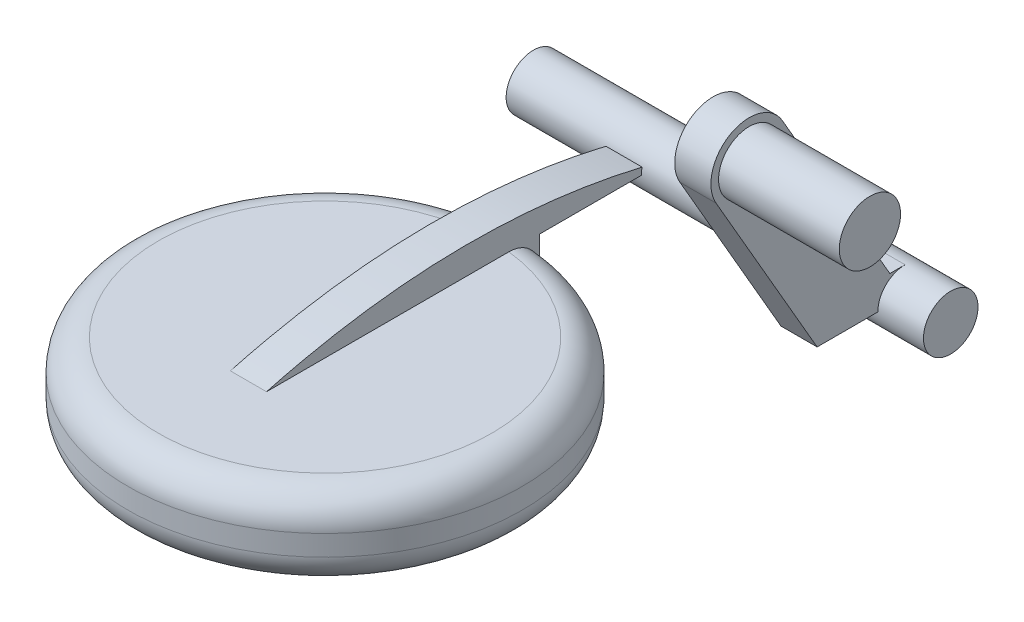
ISO-10303-21;
HEADER;
FILE_DESCRIPTION(('STEP AP214'),'2;1');
FILE_NAME('part.step','',(''),(''),'','','');
FILE_SCHEMA(('AUTOMOTIVE_DESIGN { 1 0 10303 214 1 1 1 1 }'));
ENDSEC;
DATA;
#1=APPLICATION_CONTEXT('core data for automotive mechanical design processes');
#2=APPLICATION_PROTOCOL_DEFINITION('international standard','automotive_design',2000,#1);
#3=PRODUCT_CONTEXT('',#1,'mechanical');
#4=PRODUCT('Part','Part','',(#3));
#5=PRODUCT_RELATED_PRODUCT_CATEGORY('part','',(#4));
#6=PRODUCT_DEFINITION_FORMATION('','',#4);
#7=PRODUCT_DEFINITION_CONTEXT('part definition',#1,'design');
#8=PRODUCT_DEFINITION('design','',#6,#7);
#9=PRODUCT_DEFINITION_SHAPE('','',#8);
#10=(LENGTH_UNIT() NAMED_UNIT(*) SI_UNIT(.MILLI.,.METRE.));
#11=(NAMED_UNIT(*) PLANE_ANGLE_UNIT() SI_UNIT($,.RADIAN.));
#12=(NAMED_UNIT(*) SI_UNIT($,.STERADIAN.) SOLID_ANGLE_UNIT());
#13=UNCERTAINTY_MEASURE_WITH_UNIT(LENGTH_MEASURE(1.E-05),#10,'distance_accuracy_value','');
#14=(GEOMETRIC_REPRESENTATION_CONTEXT(3) GLOBAL_UNCERTAINTY_ASSIGNED_CONTEXT((#13)) GLOBAL_UNIT_ASSIGNED_CONTEXT((#10,
#11,#12)) REPRESENTATION_CONTEXT('',''));
#15=CARTESIAN_POINT('',(0.,0.,0.));
#16=DIRECTION('',(0.,0.,1.));
#17=DIRECTION('',(1.,0.,0.));
#18=AXIS2_PLACEMENT_3D('',#15,#16,#17);
#19=CARTESIAN_POINT('',(34.5948,0.,0.));
#20=DIRECTION('',(-1.,0.,0.));
#21=DIRECTION('',(0.,0.,1.));
#22=AXIS2_PLACEMENT_3D('',#19,#20,#21);
#23=CYLINDRICAL_SURFACE('',#22,2.2606);
#24=CARTESIAN_POINT('',(0.,0.,0.));
#25=DIRECTION('',(1.,0.,0.));
#26=DIRECTION('',(0.,0.,-1.));
#27=AXIS2_PLACEMENT_3D('',#24,#25,#26);
#28=CIRCLE('',#27,2.2606);
#29=CARTESIAN_POINT('',(0.,0.,-2.2606));
#30=VERTEX_POINT('',#29);
#31=EDGE_CURVE('E252',#30,#30,#28,.T.);
#32=ORIENTED_EDGE('',*,*,#31,.T.);
#33=EDGE_LOOP('',(#32));
#34=FACE_BOUND('',#33,.T.);
#35=CARTESIAN_POINT('',(34.5948,0.,0.));
#36=DIRECTION('',(1.,0.,0.));
#37=DIRECTION('',(0.,0.,-1.));
#38=AXIS2_PLACEMENT_3D('',#35,#36,#37);
#39=CIRCLE('',#38,2.2606);
#40=CARTESIAN_POINT('',(34.5948,0.,-2.2606));
#41=VERTEX_POINT('',#40);
#42=EDGE_CURVE('E253',#41,#41,#39,.T.);
#43=ORIENTED_EDGE('',*,*,#42,.F.);
#44=EDGE_LOOP('',(#43));
#45=FACE_BOUND('',#44,.T.);
#46=DIRECTION('',(-1.,0.,0.));
#47=VECTOR('',#46,1.);
#48=CARTESIAN_POINT('',(11.2014,0.56020200266015,2.19008814348089));
#49=LINE('',#48,#47);
#50=CARTESIAN_POINT('',(11.2014,0.56020200266015,2.19008814348089));
#51=VERTEX_POINT('',#50);
#52=CARTESIAN_POINT('',(8.2042,0.56020200266015,2.19008814348089));
#53=VERTEX_POINT('',#52);
#54=EDGE_CURVE('E266',#51,#53,#49,.T.);
#55=ORIENTED_EDGE('',*,*,#54,.F.);
#56=CARTESIAN_POINT('',(11.2014,0.,0.));
#57=DIRECTION('',(1.,0.,0.));
#58=DIRECTION('',(0.,0.,-1.));
#59=AXIS2_PLACEMENT_3D('',#56,#57,#58);
#60=CIRCLE('',#59,2.2606);
#61=CARTESIAN_POINT('',(11.2014,0.,2.2606));
#62=VERTEX_POINT('',#61);
#63=EDGE_CURVE('E269',#51,#62,#60,.T.);
#64=ORIENTED_EDGE('',*,*,#63,.T.);
#65=DIRECTION('',(-1.,0.,0.));
#66=VECTOR('',#65,1.);
#67=CARTESIAN_POINT('',(34.5948,0.,2.2606));
#68=LINE('',#67,#66);
#69=CARTESIAN_POINT('',(8.2042,0.,2.2606));
#70=VERTEX_POINT('',#69);
#71=EDGE_CURVE('E262',#70,#62,#68,.F.);
#72=ORIENTED_EDGE('',*,*,#71,.F.);
#73=CARTESIAN_POINT('',(8.2042,0.,0.));
#74=DIRECTION('',(1.,0.,0.));
#75=DIRECTION('',(0.,0.,-1.));
#76=AXIS2_PLACEMENT_3D('',#73,#74,#75);
#77=CIRCLE('',#76,2.2606);
#78=EDGE_CURVE('E233',#53,#70,#77,.T.);
#79=ORIENTED_EDGE('',*,*,#78,.F.);
#80=EDGE_LOOP('',(#55,#64,#72,#79));
#81=FACE_BOUND('',#80,.T.);
#82=CARTESIAN_POINT('',(30.8102,0.,0.));
#83=DIRECTION('',(-1.,0.,0.));
#84=DIRECTION('',(0.,0.,1.));
#85=AXIS2_PLACEMENT_3D('',#82,#83,#84);
#86=CIRCLE('',#85,2.2606);
#87=CARTESIAN_POINT('',(30.8102,0.,2.2606));
#88=VERTEX_POINT('',#87);
#89=CARTESIAN_POINT('',(30.8102,2.2606,0.));
#90=VERTEX_POINT('',#89);
#91=EDGE_CURVE('E48',#88,#90,#86,.T.);
#92=ORIENTED_EDGE('',*,*,#91,.F.);
#93=DIRECTION('',(-1.,0.,0.));
#94=VECTOR('',#93,1.);
#95=CARTESIAN_POINT('',(34.5948,0.,2.2606));
#96=LINE('',#95,#94);
#97=CARTESIAN_POINT('',(27.813,0.,2.2606));
#98=VERTEX_POINT('',#97);
#99=EDGE_CURVE('E138',#98,#88,#96,.F.);
#100=ORIENTED_EDGE('',*,*,#99,.F.);
#101=CARTESIAN_POINT('',(27.813,0.,0.));
#102=DIRECTION('',(-1.,0.,0.));
#103=DIRECTION('',(0.,0.,1.));
#104=AXIS2_PLACEMENT_3D('',#101,#102,#103);
#105=CIRCLE('',#104,2.2606);
#106=CARTESIAN_POINT('',(27.813,2.2606,0.));
#107=VERTEX_POINT('',#106);
#108=EDGE_CURVE('E148',#98,#107,#105,.T.);
#109=ORIENTED_EDGE('',*,*,#108,.T.);
#110=DIRECTION('',(-1.,0.,0.));
#111=VECTOR('',#110,1.);
#112=CARTESIAN_POINT('',(30.8102,2.2606,0.));
#113=LINE('',#112,#111);
#114=EDGE_CURVE('E55',#90,#107,#113,.T.);
#115=ORIENTED_EDGE('',*,*,#114,.F.);
#116=EDGE_LOOP('',(#92,#100,#109,#115));
#117=FACE_BOUND('',#116,.T.);
#118=ADVANCED_FACE('F39',(#34,#45,#81,#117),#23,.T.);
#119=CARTESIAN_POINT('',(34.5948,0.,0.));
#120=DIRECTION('',(1.,0.,0.));
#121=DIRECTION('',(0.,0.,-1.));
#122=AXIS2_PLACEMENT_3D('',#119,#120,#121);
#123=PLANE('',#122);
#124=ORIENTED_EDGE('',*,*,#42,.T.);
#125=EDGE_LOOP('',(#124));
#126=FACE_BOUND('',#125,.T.);
#127=ADVANCED_FACE('F182',(#126),#123,.T.);
#128=CARTESIAN_POINT('',(0.,0.,0.));
#129=DIRECTION('',(1.,0.,0.));
#130=DIRECTION('',(0.,0.,-1.));
#131=AXIS2_PLACEMENT_3D('',#128,#129,#130);
#132=PLANE('',#131);
#133=ORIENTED_EDGE('',*,*,#31,.F.);
#134=EDGE_LOOP('',(#133));
#135=FACE_BOUND('',#134,.T.);
#136=ADVANCED_FACE('F179',(#135),#132,.F.);
#137=CARTESIAN_POINT('',(11.2014,0.,0.));
#138=CARTESIAN_POINT('',(11.2014,4.52526673633943,16.5083535764566));
#139=CARTESIAN_POINT('',(11.2014,0.,33.3248));
#140=B_SPLINE_CURVE_WITH_KNOTS('',2,(#137,#138,#139),.UNSPECIFIED.,.F.,.F.,(3,3),(0.,1.),.UNSPECIFIED.);
#141=DIRECTION('',(-1.,0.,0.));
#142=VECTOR('',#141,1.);
#143=SURFACE_OF_LINEAR_EXTRUSION('',#140,#142);
#144=CARTESIAN_POINT('',(11.2014,0.,33.3248));
#145=VERTEX_POINT('',#144);
#146=EDGE_CURVE('E160',#51,#145,#140,.T.);
#147=ORIENTED_EDGE('',*,*,#146,.F.);
#148=ORIENTED_EDGE('',*,*,#54,.T.);
#149=CARTESIAN_POINT('',(8.2042,0.,0.));
#150=CARTESIAN_POINT('',(8.2042,4.52526673633943,16.5083535764566));
#151=CARTESIAN_POINT('',(8.2042,0.,33.3248));
#152=B_SPLINE_CURVE_WITH_KNOTS('',2,(#149,#150,#151),.UNSPECIFIED.,.F.,.F.,(3,3),(0.,1.),.UNSPECIFIED.);
#153=CARTESIAN_POINT('',(8.2042,0.,33.3248));
#154=VERTEX_POINT('',#153);
#155=EDGE_CURVE('E154',#53,#154,#152,.T.);
#156=ORIENTED_EDGE('',*,*,#155,.T.);
#157=DIRECTION('',(-1.,0.,0.));
#158=VECTOR('',#157,1.);
#159=CARTESIAN_POINT('',(11.2014,0.,33.3248));
#160=LINE('',#159,#158);
#161=EDGE_CURVE('E249',#145,#154,#160,.T.);
#162=ORIENTED_EDGE('',*,*,#161,.F.);
#163=EDGE_LOOP('',(#147,#148,#156,#162));
#164=FACE_BOUND('',#163,.T.);
#165=ADVANCED_FACE('F174',(#164),#143,.F.);
#166=CARTESIAN_POINT('',(11.2014,0.,0.));
#167=DIRECTION('',(0.,1.,0.));
#168=DIRECTION('',(0.,0.,1.));
#169=AXIS2_PLACEMENT_3D('',#166,#167,#168);
#170=PLANE('',#169);
#171=CARTESIAN_POINT('',(9.7028,0.,26.9748));
#172=DIRECTION('',(0.,-1.,0.));
#173=DIRECTION('',(0.,0.,-1.));
#174=AXIS2_PLACEMENT_3D('',#171,#172,#173);
#175=CIRCLE('',#174,16.3576);
#176=CARTESIAN_POINT('',(8.2042,0.,10.6859917010482));
#177=VERTEX_POINT('',#176);
#178=CARTESIAN_POINT('',(11.2014,0.,10.6859917010482));
#179=VERTEX_POINT('',#178);
#180=EDGE_CURVE('E150',#177,#179,#175,.T.);
#181=ORIENTED_EDGE('',*,*,#180,.F.);
#182=DIRECTION('',(0.,0.,-1.));
#183=VECTOR('',#182,1.);
#184=CARTESIAN_POINT('',(8.2042,0.,0.));
#185=LINE('',#184,#183);
#186=EDGE_CURVE('E239',#177,#70,#185,.T.);
#187=ORIENTED_EDGE('',*,*,#186,.T.);
#188=ORIENTED_EDGE('',*,*,#71,.T.);
#189=DIRECTION('',(0.,0.,-1.));
#190=VECTOR('',#189,1.);
#191=CARTESIAN_POINT('',(11.2014,0.,0.));
#192=LINE('',#191,#190);
#193=EDGE_CURVE('E166',#179,#62,#192,.T.);
#194=ORIENTED_EDGE('',*,*,#193,.F.);
#195=EDGE_LOOP('',(#181,#187,#188,#194));
#196=FACE_BOUND('',#195,.T.);
#197=ADVANCED_FACE('F178',(#196),#170,.F.);
#198=CARTESIAN_POINT('',(11.2014,2.26263336816972,16.5853767882283));
#199=DIRECTION('',(1.,0.,0.));
#200=DIRECTION('',(0.,0.,-1.));
#201=AXIS2_PLACEMENT_3D('',#198,#199,#200);
#202=PLANE('',#201);
#203=ORIENTED_EDGE('',*,*,#63,.F.);
#204=ORIENTED_EDGE('',*,*,#146,.T.);
#205=CARTESIAN_POINT('',(11.2014,0.,13.2387063850016));
#206=VERTEX_POINT('',#205);
#207=EDGE_CURVE('E168',#145,#206,#192,.T.);
#208=ORIENTED_EDGE('',*,*,#207,.T.);
#209=CARTESIAN_POINT('',(11.2014,0.,13.2387063850016));
#210=CARTESIAN_POINT('',(11.2014,6.66730152911189E-06,13.166619963615));
#211=CARTESIAN_POINT('',(11.2014,-0.00303266526236164,13.0945363911256));
#212=CARTESIAN_POINT('',(11.2014,-0.0151552314034748,12.9508812541679));
#213=CARTESIAN_POINT('',(11.2014,-0.0242382930246242,12.8793096751909));
#214=CARTESIAN_POINT('',(11.2014,-0.0483933611801164,12.7372210436947));
#215=CARTESIAN_POINT('',(11.2014,-0.063461962828008,12.666703415257));
#216=CARTESIAN_POINT('',(11.2014,-0.0994718334890818,12.5272054484168));
#217=CARTESIAN_POINT('',(11.2014,-0.120413003358531,12.4582250840826));
#218=CARTESIAN_POINT('',(11.2014,-0.191890767008035,12.2542442392975));
#219=CARTESIAN_POINT('',(11.2014,-0.251089102506177,12.122160146318));
#220=CARTESIAN_POINT('',(11.2014,-0.390850110480242,11.8699543888949));
#221=CARTESIAN_POINT('',(11.2014,-0.47140768974803,11.7498298820145));
#222=CARTESIAN_POINT('',(11.2014,-0.651364777669318,11.5252536954704));
#223=CARTESIAN_POINT('',(11.2014,-0.750702181053836,11.4207523340078));
#224=CARTESIAN_POINT('',(11.2014,-0.965609429806438,11.229991125615));
#225=CARTESIAN_POINT('',(11.2014,-1.08118236569771,11.1437347595718));
#226=CARTESIAN_POINT('',(11.2014,-1.32467632200525,10.9923526484372));
#227=CARTESIAN_POINT('',(11.2014,-1.45253842186061,10.9271320224066));
#228=CARTESIAN_POINT('',(11.2014,-1.71739696300787,10.8192097893537));
#229=CARTESIAN_POINT('',(11.2014,-1.85438740790262,10.7764935603352));
#230=CARTESIAN_POINT('',(11.2014,-2.08356537506819,10.7258165191885));
#231=CARTESIAN_POINT('',(11.2014,-2.17427285564511,10.7108909327728));
#232=CARTESIAN_POINT('',(11.2014,-2.35664047757138,10.6909802801089));
#233=CARTESIAN_POINT('',(11.2014,-2.4482990677972,10.6859810022439));
#234=CARTESIAN_POINT('',(11.2014,-2.54,10.6859917010482));
#235=B_SPLINE_CURVE_WITH_KNOTS('',3,(#209,#210,#211,#212,#213,#214,#215,#216,#217,#218,#219,
#220,#221,#222,#223,#224,#225,#226,#227,#228,#229,#230,#231,#232,#233,#234),.UNSPECIFIED.,.F.,
.F.,(4,2,2,2,2,2,2,2,2,2,2,2,4),(0.,0.216189939212682,0.432373727656015,0.648434715227501,
0.864492055365252,1.29647493272532,1.72835489431313,2.15883084216932,2.58938884481525,
3.01797675359914,3.44628584736973,3.72156433706796,3.996448422195),.UNSPECIFIED.);
#236=CARTESIAN_POINT('',(11.2014,-2.54,10.6859917010482));
#237=VERTEX_POINT('',#236);
#238=EDGE_CURVE('E205',#206,#237,#235,.T.);
#239=ORIENTED_EDGE('',*,*,#238,.T.);
#240=DIRECTION('',(0.,1.,0.));
#241=VECTOR('',#240,1.);
#242=CARTESIAN_POINT('',(11.2014,0.,10.6859917010482));
#243=LINE('',#242,#241);
#244=EDGE_CURVE('E63',#179,#237,#243,.F.);
#245=ORIENTED_EDGE('',*,*,#244,.F.);
#246=ORIENTED_EDGE('',*,*,#193,.T.);
#247=EDGE_LOOP('',(#203,#204,#208,#239,#245,#246));
#248=FACE_BOUND('',#247,.T.);
#249=ADVANCED_FACE('F214',(#248),#202,.T.);
#250=CARTESIAN_POINT('',(8.2042,2.26263336816972,16.5853767882283));
#251=DIRECTION('',(1.,0.,0.));
#252=DIRECTION('',(0.,0.,-1.));
#253=AXIS2_PLACEMENT_3D('',#250,#251,#252);
#254=PLANE('',#253);
#255=ORIENTED_EDGE('',*,*,#155,.F.);
#256=ORIENTED_EDGE('',*,*,#78,.T.);
#257=ORIENTED_EDGE('',*,*,#186,.F.);
#258=DIRECTION('',(0.,1.,0.));
#259=VECTOR('',#258,1.);
#260=CARTESIAN_POINT('',(8.2042,-2.54,10.6859917010482));
#261=LINE('',#260,#259);
#262=CARTESIAN_POINT('',(8.2042,-2.54,10.6859917010482));
#263=VERTEX_POINT('',#262);
#264=EDGE_CURVE('E283',#263,#177,#261,.T.);
#265=ORIENTED_EDGE('',*,*,#264,.F.);
#266=CARTESIAN_POINT('',(8.2042,-2.54,10.6859917010482));
#267=CARTESIAN_POINT('',(8.2042,-2.46878712261462,10.6859846976493));
#268=CARTESIAN_POINT('',(8.2042,-2.39757756650257,10.6889991626972));
#269=CARTESIAN_POINT('',(8.2042,-2.25566940685369,10.7010168680997));
#270=CARTESIAN_POINT('',(8.2042,-2.18497077534097,10.7100197780043));
#271=CARTESIAN_POINT('',(8.2042,-2.04464134987495,10.7339498982054));
#272=CARTESIAN_POINT('',(8.2042,-1.97500968749409,10.7488719920277));
#273=CARTESIAN_POINT('',(8.2042,-1.83726819618154,10.7845171241889));
#274=CARTESIAN_POINT('',(8.2042,-1.76915835072414,10.8052400995019));
#275=CARTESIAN_POINT('',(8.2042,-1.5677729492938,10.8759367880361));
#276=CARTESIAN_POINT('',(8.2042,-1.43737922514917,10.9344489501707));
#277=CARTESIAN_POINT('',(8.2042,-1.18833699615202,11.0724611510333));
#278=CARTESIAN_POINT('',(8.2042,-1.06968677242453,11.1519581119894));
#279=CARTESIAN_POINT('',(8.2042,-0.847152726743869,11.3298321074568));
#280=CARTESIAN_POINT('',(8.2042,-0.743293775972376,11.4282403031244));
#281=CARTESIAN_POINT('',(8.2042,-0.553476928981652,11.6410530909947));
#282=CARTESIAN_POINT('',(8.2042,-0.467522558029146,11.7554608259796));
#283=CARTESIAN_POINT('',(8.2042,-0.315580639627117,11.9975083331269));
#284=CARTESIAN_POINT('',(8.2042,-0.249679048005572,12.1252020049424));
#285=CARTESIAN_POINT('',(8.2042,-0.14016224597179,12.3897828450969));
#286=CARTESIAN_POINT('',(8.2042,-0.0965359171179298,12.5266653882349));
#287=CARTESIAN_POINT('',(8.2042,-0.0431440224773883,12.7600428095158));
#288=CARTESIAN_POINT('',(8.2042,-0.0269725684936031,12.8551230081658));
#289=CARTESIAN_POINT('',(8.2042,-0.00540168460718157,13.0463585624552));
#290=CARTESIAN_POINT('',(8.2042,1.32434687350132E-05,13.1425121701955));
#291=CARTESIAN_POINT('',(8.2042,0.,13.2387063850016));
#292=B_SPLINE_CURVE_WITH_KNOTS('',3,(#266,#267,#268,#269,#270,#271,#272,#273,#274,#275,#276,
#277,#278,#279,#280,#281,#282,#283,#284,#285,#286,#287,#288,#289,#290,#291),.UNSPECIFIED.,.F.,
.F.,(4,2,2,2,2,2,2,2,2,2,2,2,4),(0.,0.213568885257439,0.427125986484304,0.640498892272121,
0.853869479876623,1.28042340527735,1.70691480413287,2.13411507898332,2.56139938676838,
2.99049024391901,3.41936671540876,3.70813396326445,3.99648484803328),.UNSPECIFIED.);
#293=CARTESIAN_POINT('',(8.2042,0.,13.2387063850016));
#294=VERTEX_POINT('',#293);
#295=EDGE_CURVE('E198',#263,#294,#292,.T.);
#296=ORIENTED_EDGE('',*,*,#295,.T.);
#297=EDGE_CURVE('E167',#154,#294,#185,.T.);
#298=ORIENTED_EDGE('',*,*,#297,.F.);
#299=EDGE_LOOP('',(#255,#256,#257,#265,#296,#298));
#300=FACE_BOUND('',#299,.T.);
#301=ADVANCED_FACE('F218',(#300),#254,.F.);
#302=CARTESIAN_POINT('',(9.7028,-6.7818,26.9748));
#303=DIRECTION('',(0.,1.,0.));
#304=DIRECTION('',(0.,0.,1.));
#305=AXIS2_PLACEMENT_3D('',#302,#303,#304);
#306=CYLINDRICAL_SURFACE('',#305,16.3576);
#307=CARTESIAN_POINT('',(9.7028,-4.2418,26.9748));
#308=DIRECTION('',(0.,-1.,0.));
#309=DIRECTION('',(0.,0.,-1.));
#310=AXIS2_PLACEMENT_3D('',#307,#308,#309);
#311=CIRCLE('',#310,16.3576);
#312=CARTESIAN_POINT('',(9.7028,-4.2418,10.6172));
#313=VERTEX_POINT('',#312);
#314=EDGE_CURVE('E273',#313,#313,#311,.F.);
#315=ORIENTED_EDGE('',*,*,#314,.T.);
#316=EDGE_LOOP('',(#315));
#317=FACE_BOUND('',#316,.T.);
#318=CARTESIAN_POINT('',(9.7028,-2.54,26.9748));
#319=DIRECTION('',(0.,-1.,0.));
#320=DIRECTION('',(0.,0.,-1.));
#321=AXIS2_PLACEMENT_3D('',#318,#319,#320);
#322=CIRCLE('',#321,16.3576);
#323=EDGE_CURVE('E279',#237,#263,#322,.T.);
#324=ORIENTED_EDGE('',*,*,#323,.T.);
#325=ORIENTED_EDGE('',*,*,#264,.T.);
#326=ORIENTED_EDGE('',*,*,#180,.T.);
#327=ORIENTED_EDGE('',*,*,#244,.T.);
#328=EDGE_LOOP('',(#324,#325,#326,#327));
#329=FACE_BOUND('',#328,.T.);
#330=ADVANCED_FACE('F219',(#317,#329),#306,.T.);
#331=CARTESIAN_POINT('',(9.7028,-6.7818,26.9748));
#332=DIRECTION('',(0.,-1.,0.));
#333=DIRECTION('',(0.,0.,-1.));
#334=AXIS2_PLACEMENT_3D('',#331,#332,#333);
#335=PLANE('',#334);
#336=CARTESIAN_POINT('',(9.7028,-6.7818,26.9748));
#337=DIRECTION('',(0.,-1.,0.));
#338=DIRECTION('',(0.,0.,-1.));
#339=AXIS2_PLACEMENT_3D('',#336,#337,#338);
#340=CIRCLE('',#339,13.8176);
#341=CARTESIAN_POINT('',(9.7028,-6.7818,13.1572));
#342=VERTEX_POINT('',#341);
#343=EDGE_CURVE('E288',#342,#342,#340,.T.);
#344=ORIENTED_EDGE('',*,*,#343,.T.);
#345=EDGE_LOOP('',(#344));
#346=FACE_BOUND('',#345,.T.);
#347=ADVANCED_FACE('F227',(#346),#335,.T.);
#348=CARTESIAN_POINT('',(9.7028,0.,26.9748));
#349=DIRECTION('',(0.,-1.,0.));
#350=DIRECTION('',(0.,0.,-1.));
#351=AXIS2_PLACEMENT_3D('',#348,#349,#350);
#352=PLANE('',#351);
#353=ORIENTED_EDGE('',*,*,#297,.T.);
#354=CARTESIAN_POINT('',(9.7028,0.,26.9748));
#355=DIRECTION('',(0.,-1.,0.));
#356=DIRECTION('',(0.,0.,-1.));
#357=AXIS2_PLACEMENT_3D('',#354,#355,#356);
#358=CIRCLE('',#357,13.8176);
#359=EDGE_CURVE('E286',#294,#206,#358,.F.);
#360=ORIENTED_EDGE('',*,*,#359,.T.);
#361=ORIENTED_EDGE('',*,*,#207,.F.);
#362=ORIENTED_EDGE('',*,*,#161,.T.);
#363=EDGE_LOOP('',(#353,#360,#361,#362));
#364=FACE_BOUND('',#363,.T.);
#365=ADVANCED_FACE('F194',(#364),#352,.F.);
#366=CARTESIAN_POINT('',(9.7028,-2.54,26.9748));
#367=DIRECTION('',(0.,-1.,0.));
#368=DIRECTION('',(0.,0.,-1.));
#369=AXIS2_PLACEMENT_3D('',#366,#367,#368);
#370=TOROIDAL_SURFACE('',#369,13.8176,2.54);
#371=ORIENTED_EDGE('',*,*,#238,.F.);
#372=ORIENTED_EDGE('',*,*,#359,.F.);
#373=ORIENTED_EDGE('',*,*,#295,.F.);
#374=ORIENTED_EDGE('',*,*,#323,.F.);
#375=EDGE_LOOP('',(#371,#372,#373,#374));
#376=FACE_BOUND('',#375,.T.);
#377=ADVANCED_FACE('F191',(#376),#370,.T.);
#378=CARTESIAN_POINT('',(9.7028,-4.2418,26.9748));
#379=DIRECTION('',(0.,-1.,0.));
#380=DIRECTION('',(0.,0.,-1.));
#381=AXIS2_PLACEMENT_3D('',#378,#379,#380);
#382=TOROIDAL_SURFACE('',#381,13.8176,2.54);
#383=ORIENTED_EDGE('',*,*,#314,.F.);
#384=EDGE_LOOP('',(#383));
#385=FACE_BOUND('',#384,.T.);
#386=ORIENTED_EDGE('',*,*,#343,.F.);
#387=EDGE_LOOP('',(#386));
#388=FACE_BOUND('',#387,.T.);
#389=ADVANCED_FACE('F41',(#385,#388),#382,.T.);
#390=CARTESIAN_POINT('',(30.8102,0.,0.));
#391=DIRECTION('',(0.,1.,0.));
#392=DIRECTION('',(0.,0.,1.));
#393=AXIS2_PLACEMENT_3D('',#390,#391,#392);
#394=PLANE('',#393);
#395=DIRECTION('',(0.,0.,-1.));
#396=VECTOR('',#395,1.);
#397=CARTESIAN_POINT('',(27.813,0.,0.));
#398=LINE('',#397,#396);
#399=CARTESIAN_POINT('',(27.813,0.,7.2898));
#400=VERTEX_POINT('',#399);
#401=EDGE_CURVE('E145',#400,#98,#398,.T.);
#402=ORIENTED_EDGE('',*,*,#401,.T.);
#403=ORIENTED_EDGE('',*,*,#99,.T.);
#404=DIRECTION('',(0.,0.,-1.));
#405=VECTOR('',#404,1.);
#406=CARTESIAN_POINT('',(30.8102,0.,0.));
#407=LINE('',#406,#405);
#408=CARTESIAN_POINT('',(30.8102,0.,7.2898));
#409=VERTEX_POINT('',#408);
#410=EDGE_CURVE('E134',#409,#88,#407,.T.);
#411=ORIENTED_EDGE('',*,*,#410,.F.);
#412=DIRECTION('',(-1.,0.,0.));
#413=VECTOR('',#412,1.);
#414=CARTESIAN_POINT('',(30.8102,0.,7.2898));
#415=LINE('',#414,#413);
#416=EDGE_CURVE('E475',#409,#400,#415,.T.);
#417=ORIENTED_EDGE('',*,*,#416,.T.);
#418=EDGE_LOOP('',(#402,#403,#411,#417));
#419=FACE_BOUND('',#418,.T.);
#420=ADVANCED_FACE('F360',(#419),#394,.F.);
#421=CARTESIAN_POINT('',(30.8102,2.2606,1.26260959982182));
#422=DIRECTION('',(0.,-1.,0.));
#423=DIRECTION('',(0.,0.,-1.));
#424=AXIS2_PLACEMENT_3D('',#421,#422,#423);
#425=PLANE('',#424);
#426=DIRECTION('',(0.,0.,1.));
#427=VECTOR('',#426,1.);
#428=CARTESIAN_POINT('',(27.813,2.2606,1.26260959982182));
#429=LINE('',#428,#427);
#430=CARTESIAN_POINT('',(27.813,2.2606,1.26260959982182));
#431=VERTEX_POINT('',#430);
#432=EDGE_CURVE('E460',#107,#431,#429,.T.);
#433=ORIENTED_EDGE('',*,*,#432,.T.);
#434=DIRECTION('',(-1.,0.,0.));
#435=VECTOR('',#434,1.);
#436=CARTESIAN_POINT('',(30.8102,2.2606,1.26260959982182));
#437=LINE('',#436,#435);
#438=CARTESIAN_POINT('',(30.8102,2.2606,1.26260959982182));
#439=VERTEX_POINT('',#438);
#440=EDGE_CURVE('E141',#439,#431,#437,.T.);
#441=ORIENTED_EDGE('',*,*,#440,.F.);
#442=DIRECTION('',(0.,0.,1.));
#443=VECTOR('',#442,1.);
#444=CARTESIAN_POINT('',(30.8102,2.2606,1.26260959982182));
#445=LINE('',#444,#443);
#446=EDGE_CURVE('E131',#90,#439,#445,.T.);
#447=ORIENTED_EDGE('',*,*,#446,.F.);
#448=ORIENTED_EDGE('',*,*,#114,.T.);
#449=EDGE_LOOP('',(#433,#441,#447,#448));
#450=FACE_BOUND('',#449,.T.);
#451=ADVANCED_FACE('F139',(#450),#425,.F.);
#452=CARTESIAN_POINT('',(30.8102,17.6930498690423,10.1725386859688));
#453=DIRECTION('',(0.,-0.499999999999998,0.86602540378444));
#454=DIRECTION('',(0.,-0.86602540378444,-0.499999999999998));
#455=AXIS2_PLACEMENT_3D('',#452,#453,#454);
#456=PLANE('',#455);
#457=DIRECTION('',(0.,0.86602540378444,0.499999999999998));
#458=VECTOR('',#457,1.);
#459=CARTESIAN_POINT('',(27.813,17.6930498690423,10.1725386859688));
#460=LINE('',#459,#458);
#461=CARTESIAN_POINT('',(27.813,17.6930498690423,10.1725386859688));
#462=VERTEX_POINT('',#461);
#463=EDGE_CURVE('E463',#431,#462,#460,.T.);
#464=ORIENTED_EDGE('',*,*,#463,.T.);
#465=DIRECTION('',(-1.,0.,0.));
#466=VECTOR('',#465,1.);
#467=CARTESIAN_POINT('',(30.8102,17.6930498690423,10.1725386859688));
#468=LINE('',#467,#466);
#469=CARTESIAN_POINT('',(30.8102,17.6930498690423,10.1725386859688));
#470=VERTEX_POINT('',#469);
#471=EDGE_CURVE('E156',#470,#462,#468,.T.);
#472=ORIENTED_EDGE('',*,*,#471,.F.);
#473=DIRECTION('',(0.,0.86602540378444,0.499999999999998));
#474=VECTOR('',#473,1.);
#475=CARTESIAN_POINT('',(30.8102,17.6930498690423,10.1725386859688));
#476=LINE('',#475,#474);
#477=EDGE_CURVE('E144',#439,#470,#476,.T.);
#478=ORIENTED_EDGE('',*,*,#477,.F.);
#479=ORIENTED_EDGE('',*,*,#440,.T.);
#480=EDGE_LOOP('',(#464,#472,#478,#479));
#481=FACE_BOUND('',#480,.T.);
#482=ADVANCED_FACE('F384',(#481),#456,.F.);
#483=CARTESIAN_POINT('',(30.8102,16.1055498690423,12.9221693429844));
#484=DIRECTION('',(-1.,0.,0.));
#485=DIRECTION('',(0.,0.,1.));
#486=AXIS2_PLACEMENT_3D('',#483,#484,#485);
#487=CYLINDRICAL_SURFACE('',#486,3.175);
#488=CARTESIAN_POINT('',(27.813,16.1055498690423,12.9221693429844));
#489=DIRECTION('',(1.,0.,0.));
#490=DIRECTION('',(0.,0.,1.));
#491=AXIS2_PLACEMENT_3D('',#488,#489,#490);
#492=CIRCLE('',#491,3.175);
#493=CARTESIAN_POINT('',(27.813,14.5180498690423,15.6718));
#494=VERTEX_POINT('',#493);
#495=EDGE_CURVE('E479',#462,#494,#492,.T.);
#496=ORIENTED_EDGE('',*,*,#495,.T.);
#497=DIRECTION('',(-1.,0.,0.));
#498=VECTOR('',#497,1.);
#499=CARTESIAN_POINT('',(30.8102,14.5180498690423,15.6718));
#500=LINE('',#499,#498);
#501=CARTESIAN_POINT('',(30.8102,14.5180498690423,15.6718));
#502=VERTEX_POINT('',#501);
#503=EDGE_CURVE('E491',#502,#494,#500,.T.);
#504=ORIENTED_EDGE('',*,*,#503,.F.);
#505=CARTESIAN_POINT('',(30.8102,16.1055498690423,12.9221693429844));
#506=DIRECTION('',(1.,0.,0.));
#507=DIRECTION('',(0.,0.,1.));
#508=AXIS2_PLACEMENT_3D('',#505,#506,#507);
#509=CIRCLE('',#508,3.175);
#510=EDGE_CURVE('E468',#470,#502,#509,.T.);
#511=ORIENTED_EDGE('',*,*,#510,.F.);
#512=ORIENTED_EDGE('',*,*,#471,.T.);
#513=EDGE_LOOP('',(#496,#504,#511,#512));
#514=FACE_BOUND('',#513,.T.);
#515=ADVANCED_FACE('F393',(#514),#487,.T.);
#516=CARTESIAN_POINT('',(30.8102,0.,7.2898));
#517=DIRECTION('',(0.,0.499999999999998,-0.86602540378444));
#518=DIRECTION('',(0.,0.86602540378444,0.499999999999998));
#519=AXIS2_PLACEMENT_3D('',#516,#517,#518);
#520=PLANE('',#519);
#521=DIRECTION('',(0.,-0.86602540378444,-0.499999999999998));
#522=VECTOR('',#521,1.);
#523=CARTESIAN_POINT('',(27.813,0.,7.2898));
#524=LINE('',#523,#522);
#525=EDGE_CURVE('E482',#494,#400,#524,.T.);
#526=ORIENTED_EDGE('',*,*,#525,.T.);
#527=ORIENTED_EDGE('',*,*,#416,.F.);
#528=DIRECTION('',(0.,-0.86602540378444,-0.499999999999998));
#529=VECTOR('',#528,1.);
#530=CARTESIAN_POINT('',(30.8102,0.,7.2898));
#531=LINE('',#530,#529);
#532=EDGE_CURVE('E471',#502,#409,#531,.T.);
#533=ORIENTED_EDGE('',*,*,#532,.F.);
#534=ORIENTED_EDGE('',*,*,#503,.T.);
#535=EDGE_LOOP('',(#526,#527,#533,#534));
#536=FACE_BOUND('',#535,.T.);
#537=ADVANCED_FACE('F403',(#536),#520,.F.);
#538=CARTESIAN_POINT('',(30.8102,16.1055498690423,12.9221693429844));
#539=DIRECTION('',(-1.,0.,0.));
#540=DIRECTION('',(0.,0.,1.));
#541=AXIS2_PLACEMENT_3D('',#538,#539,#540);
#542=PLANE('',#541);
#543=CARTESIAN_POINT('',(30.8102,16.1055498690423,12.9221693429844));
#544=DIRECTION('',(-1.,0.,0.));
#545=DIRECTION('',(0.,0.,1.));
#546=AXIS2_PLACEMENT_3D('',#543,#544,#545);
#547=CIRCLE('',#546,2.54);
#548=CARTESIAN_POINT('',(30.8102,16.1055498690423,15.4621693429844));
#549=VERTEX_POINT('',#548);
#550=EDGE_CURVE('E11',#549,#549,#547,.F.);
#551=ORIENTED_EDGE('',*,*,#550,.F.);
#552=EDGE_LOOP('',(#551));
#553=FACE_BOUND('',#552,.T.);
#554=ORIENTED_EDGE('',*,*,#410,.T.);
#555=ORIENTED_EDGE('',*,*,#91,.T.);
#556=ORIENTED_EDGE('',*,*,#446,.T.);
#557=ORIENTED_EDGE('',*,*,#477,.T.);
#558=ORIENTED_EDGE('',*,*,#510,.T.);
#559=ORIENTED_EDGE('',*,*,#532,.T.);
#560=EDGE_LOOP('',(#554,#555,#556,#557,#558,#559));
#561=FACE_BOUND('',#560,.T.);
#562=ADVANCED_FACE('F130',(#553,#561),#542,.F.);
#563=CARTESIAN_POINT('',(27.813,16.1055498690423,12.9221693429844));
#564=DIRECTION('',(-1.,0.,0.));
#565=DIRECTION('',(0.,0.,1.));
#566=AXIS2_PLACEMENT_3D('',#563,#564,#565);
#567=PLANE('',#566);
#568=ORIENTED_EDGE('',*,*,#108,.F.);
#569=ORIENTED_EDGE('',*,*,#401,.F.);
#570=ORIENTED_EDGE('',*,*,#525,.F.);
#571=ORIENTED_EDGE('',*,*,#495,.F.);
#572=ORIENTED_EDGE('',*,*,#463,.F.);
#573=ORIENTED_EDGE('',*,*,#432,.F.);
#574=EDGE_LOOP('',(#568,#569,#570,#571,#572,#573));
#575=FACE_BOUND('',#574,.T.);
#576=ADVANCED_FACE('F420',(#575),#567,.T.);
#577=CARTESIAN_POINT('',(40.8178,16.1055498690423,12.9221693429844));
#578=DIRECTION('',(-1.,0.,0.));
#579=DIRECTION('',(0.,0.,1.));
#580=AXIS2_PLACEMENT_3D('',#577,#578,#579);
#581=CYLINDRICAL_SURFACE('',#580,2.54);
#582=CARTESIAN_POINT('',(40.8178,16.1055498690423,12.9221693429844));
#583=DIRECTION('',(1.,0.,0.));
#584=DIRECTION('',(0.,0.,-1.));
#585=AXIS2_PLACEMENT_3D('',#582,#583,#584);
#586=CIRCLE('',#585,2.54);
#587=CARTESIAN_POINT('',(40.8178,16.1055498690423,10.3821693429844));
#588=VERTEX_POINT('',#587);
#589=EDGE_CURVE('E458',#588,#588,#586,.T.);
#590=ORIENTED_EDGE('',*,*,#589,.F.);
#591=EDGE_LOOP('',(#590));
#592=FACE_BOUND('',#591,.T.);
#593=ORIENTED_EDGE('',*,*,#550,.T.);
#594=EDGE_LOOP('',(#593));
#595=FACE_BOUND('',#594,.T.);
#596=ADVANCED_FACE('F425',(#592,#595),#581,.T.);
#597=CARTESIAN_POINT('',(40.8178,16.1055498690423,12.9221693429844));
#598=DIRECTION('',(1.,0.,0.));
#599=DIRECTION('',(0.,0.,-1.));
#600=AXIS2_PLACEMENT_3D('',#597,#598,#599);
#601=PLANE('',#600);
#602=ORIENTED_EDGE('',*,*,#589,.T.);
#603=EDGE_LOOP('',(#602));
#604=FACE_BOUND('',#603,.T.);
#605=ADVANCED_FACE('F442',(#604),#601,.T.);
#606=CLOSED_SHELL('',(#118,#127,#136,#165,#197,#249,#301,#330,#347,#365,#377,#389,#420,#451,
#482,#515,#537,#562,#576,#596,#605));
#607=MANIFOLD_SOLID_BREP('B2',#606);
#608=ADVANCED_BREP_SHAPE_REPRESENTATION('',(#18,#607),#14);
#609=SHAPE_DEFINITION_REPRESENTATION(#9,#608);
ENDSEC;
END-ISO-10303-21;
